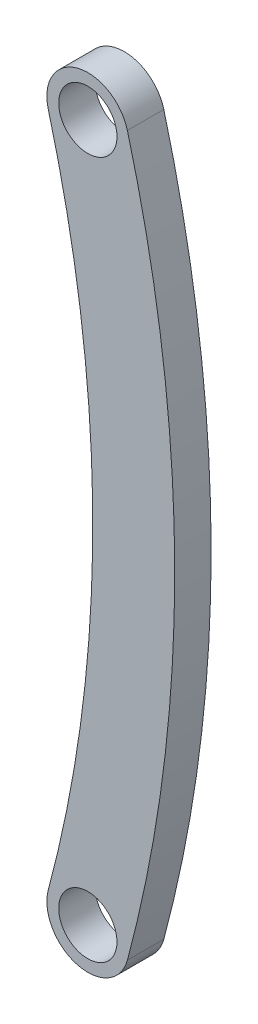
ISO-10303-21;
HEADER;
FILE_DESCRIPTION(('STEP AP214'),'2;1');
FILE_NAME('part.step','',(''),(''),'','','');
FILE_SCHEMA(('AUTOMOTIVE_DESIGN { 1 0 10303 214 1 1 1 1 }'));
ENDSEC;
DATA;
#1=APPLICATION_CONTEXT('core data for automotive mechanical design processes');
#2=APPLICATION_PROTOCOL_DEFINITION('international standard','automotive_design',2000,#1);
#3=PRODUCT_CONTEXT('',#1,'mechanical');
#4=PRODUCT('Part','Part','',(#3));
#5=PRODUCT_RELATED_PRODUCT_CATEGORY('part','',(#4));
#6=PRODUCT_DEFINITION_FORMATION('','',#4);
#7=PRODUCT_DEFINITION_CONTEXT('part definition',#1,'design');
#8=PRODUCT_DEFINITION('design','',#6,#7);
#9=PRODUCT_DEFINITION_SHAPE('','',#8);
#10=(LENGTH_UNIT() NAMED_UNIT(*) SI_UNIT(.MILLI.,.METRE.));
#11=(NAMED_UNIT(*) PLANE_ANGLE_UNIT() SI_UNIT($,.RADIAN.));
#12=(NAMED_UNIT(*) SI_UNIT($,.STERADIAN.) SOLID_ANGLE_UNIT());
#13=UNCERTAINTY_MEASURE_WITH_UNIT(LENGTH_MEASURE(1.E-05),#10,'distance_accuracy_value','');
#14=(GEOMETRIC_REPRESENTATION_CONTEXT(3) GLOBAL_UNCERTAINTY_ASSIGNED_CONTEXT((#13)) GLOBAL_UNIT_ASSIGNED_CONTEXT((#10,
#11,#12)) REPRESENTATION_CONTEXT('',''));
#15=CARTESIAN_POINT('',(0.,0.,0.));
#16=DIRECTION('',(0.,0.,1.));
#17=DIRECTION('',(1.,0.,0.));
#18=AXIS2_PLACEMENT_3D('',#15,#16,#17);
#19=CARTESIAN_POINT('',(71.478511145391,19.152609337587,45.75));
#20=DIRECTION('',(0.,0.,1.));
#21=DIRECTION('',(1.,0.,0.));
#22=AXIS2_PLACEMENT_3D('',#19,#20,#21);
#23=CYLINDRICAL_SURFACE('',#22,1.6);
#24=DIRECTION('',(0.,0.,1.));
#25=VECTOR('',#24,1.);
#26=CARTESIAN_POINT('',(73.078511145391,19.152609337587,45.75));
#27=LINE('',#26,#25);
#28=CARTESIAN_POINT('',(73.078511145391,19.152609337587,46.75));
#29=VERTEX_POINT('',#28);
#30=CARTESIAN_POINT('',(73.078511145391,19.152609337587,48.75));
#31=VERTEX_POINT('',#30);
#32=EDGE_CURVE('E9',#29,#31,#27,.T.);
#33=ORIENTED_EDGE('',*,*,#32,.F.);
#34=CARTESIAN_POINT('',(71.478511145391,19.152609337587,46.75));
#35=DIRECTION('',(0.,0.,1.));
#36=DIRECTION('',(1.,0.,0.));
#37=AXIS2_PLACEMENT_3D('',#34,#35,#36);
#38=CIRCLE('',#37,1.6);
#39=EDGE_CURVE('E93',#29,#29,#38,.T.);
#40=ORIENTED_EDGE('',*,*,#39,.F.);
#41=ORIENTED_EDGE('',*,*,#32,.T.);
#42=CARTESIAN_POINT('',(71.478511145391,19.152609337587,48.75));
#43=DIRECTION('',(0.,0.,1.));
#44=DIRECTION('',(1.,0.,0.));
#45=AXIS2_PLACEMENT_3D('',#42,#43,#44);
#46=CIRCLE('',#45,1.6);
#47=EDGE_CURVE('E120',#31,#31,#46,.T.);
#48=ORIENTED_EDGE('',*,*,#47,.T.);
#49=EDGE_LOOP('',(#33,#40,#41,#48));
#50=FACE_BOUND('',#49,.T.);
#51=ADVANCED_FACE('F15',(#50),#23,.F.);
#52=CARTESIAN_POINT('',(71.478511145391,-19.15260933758,45.75));
#53=DIRECTION('',(0.,0.,1.));
#54=DIRECTION('',(1.,0.,0.));
#55=AXIS2_PLACEMENT_3D('',#52,#53,#54);
#56=CYLINDRICAL_SURFACE('',#55,1.6);
#57=DIRECTION('',(0.,0.,1.));
#58=VECTOR('',#57,1.);
#59=CARTESIAN_POINT('',(73.078511145391,-19.15260933758,45.75));
#60=LINE('',#59,#58);
#61=CARTESIAN_POINT('',(73.078511145391,-19.15260933758,46.75));
#62=VERTEX_POINT('',#61);
#63=CARTESIAN_POINT('',(73.078511145391,-19.15260933758,48.75));
#64=VERTEX_POINT('',#63);
#65=EDGE_CURVE('E25',#62,#64,#60,.T.);
#66=ORIENTED_EDGE('',*,*,#65,.F.);
#67=CARTESIAN_POINT('',(71.478511145391,-19.15260933758,46.75));
#68=DIRECTION('',(0.,0.,1.));
#69=DIRECTION('',(1.,0.,0.));
#70=AXIS2_PLACEMENT_3D('',#67,#68,#69);
#71=CIRCLE('',#70,1.6);
#72=EDGE_CURVE('E99',#62,#62,#71,.T.);
#73=ORIENTED_EDGE('',*,*,#72,.F.);
#74=ORIENTED_EDGE('',*,*,#65,.T.);
#75=CARTESIAN_POINT('',(71.478511145391,-19.15260933758,48.75));
#76=DIRECTION('',(0.,0.,1.));
#77=DIRECTION('',(1.,0.,0.));
#78=AXIS2_PLACEMENT_3D('',#75,#76,#77);
#79=CIRCLE('',#78,1.6);
#80=EDGE_CURVE('E117',#64,#64,#79,.T.);
#81=ORIENTED_EDGE('',*,*,#80,.T.);
#82=EDGE_LOOP('',(#66,#73,#74,#81));
#83=FACE_BOUND('',#82,.T.);
#84=ADVANCED_FACE('F17',(#83),#56,.F.);
#85=CARTESIAN_POINT('',(0.,0.,46.75));
#86=DIRECTION('',(0.,0.,1.));
#87=DIRECTION('',(0.965925826288944,-0.258819045102985,0.));
#88=AXIS2_PLACEMENT_3D('',#85,#86,#87);
#89=CYLINDRICAL_SURFACE('',#88,71.75);
#90=DIRECTION('',(0.,0.,1.));
#91=VECTOR('',#90,1.);
#92=CARTESIAN_POINT('',(69.305178036241,18.570266486106,46.75));
#93=LINE('',#92,#91);
#94=CARTESIAN_POINT('',(69.305178036241,18.570266486106,46.75));
#95=VERTEX_POINT('',#94);
#96=CARTESIAN_POINT('',(69.305178036241,18.570266486106,48.75));
#97=VERTEX_POINT('',#96);
#98=EDGE_CURVE('E96',#95,#97,#93,.T.);
#99=ORIENTED_EDGE('',*,*,#98,.F.);
#100=CARTESIAN_POINT('',(0.,0.,46.75));
#101=DIRECTION('',(0.,0.,1.));
#102=DIRECTION('',(0.965925826288944,-0.258819045102985,0.));
#103=AXIS2_PLACEMENT_3D('',#100,#101,#102);
#104=CIRCLE('',#103,71.75);
#105=CARTESIAN_POINT('',(69.305178036241,-18.5702664861,46.75));
#106=VERTEX_POINT('',#105);
#107=EDGE_CURVE('E94',#106,#95,#104,.T.);
#108=ORIENTED_EDGE('',*,*,#107,.F.);
#109=DIRECTION('',(0.,0.,1.));
#110=VECTOR('',#109,1.);
#111=CARTESIAN_POINT('',(69.305178036241,-18.5702664861,46.75));
#112=LINE('',#111,#110);
#113=CARTESIAN_POINT('',(69.305178036241,-18.5702664861,48.75));
#114=VERTEX_POINT('',#113);
#115=EDGE_CURVE('E78',#106,#114,#112,.T.);
#116=ORIENTED_EDGE('',*,*,#115,.T.);
#117=CARTESIAN_POINT('',(0.,0.,48.75));
#118=DIRECTION('',(0.,0.,1.));
#119=DIRECTION('',(0.965925826288944,-0.258819045102985,0.));
#120=AXIS2_PLACEMENT_3D('',#117,#118,#119);
#121=CIRCLE('',#120,71.75);
#122=EDGE_CURVE('E128',#114,#97,#121,.T.);
#123=ORIENTED_EDGE('',*,*,#122,.T.);
#124=EDGE_LOOP('',(#99,#108,#116,#123));
#125=FACE_BOUND('',#124,.T.);
#126=ADVANCED_FACE('F92',(#125),#89,.F.);
#127=CARTESIAN_POINT('',(71.478511145391,-19.15260933758,46.75));
#128=DIRECTION('',(0.,0.,1.));
#129=DIRECTION('',(1.,0.,0.));
#130=AXIS2_PLACEMENT_3D('',#127,#128,#129);
#131=CYLINDRICAL_SURFACE('',#130,2.25);
#132=CARTESIAN_POINT('',(71.478511145391,-19.15260933758,48.75));
#133=DIRECTION('',(0.,0.,1.));
#134=DIRECTION('',(1.,0.,0.));
#135=AXIS2_PLACEMENT_3D('',#132,#133,#134);
#136=CIRCLE('',#135,2.25);
#137=CARTESIAN_POINT('',(73.651844254541,-19.73495218906,48.75));
#138=VERTEX_POINT('',#137);
#139=EDGE_CURVE('E88',#114,#138,#136,.T.);
#140=ORIENTED_EDGE('',*,*,#139,.F.);
#141=ORIENTED_EDGE('',*,*,#115,.F.);
#142=CARTESIAN_POINT('',(71.478511145391,-19.15260933758,46.75));
#143=DIRECTION('',(0.,0.,1.));
#144=DIRECTION('',(1.,0.,0.));
#145=AXIS2_PLACEMENT_3D('',#142,#143,#144);
#146=CIRCLE('',#145,2.25);
#147=CARTESIAN_POINT('',(73.651844254541,-19.73495218906,46.75));
#148=VERTEX_POINT('',#147);
#149=EDGE_CURVE('E82',#106,#148,#146,.T.);
#150=ORIENTED_EDGE('',*,*,#149,.T.);
#151=DIRECTION('',(0.,0.,1.));
#152=VECTOR('',#151,1.);
#153=CARTESIAN_POINT('',(73.651844254541,-19.73495218906,46.75));
#154=LINE('',#153,#152);
#155=EDGE_CURVE('E222',#148,#138,#154,.T.);
#156=ORIENTED_EDGE('',*,*,#155,.T.);
#157=EDGE_LOOP('',(#140,#141,#150,#156));
#158=FACE_BOUND('',#157,.T.);
#159=ADVANCED_FACE('F81',(#158),#131,.T.);
#160=CARTESIAN_POINT('',(0.,0.,46.75));
#161=DIRECTION('',(0.,0.,1.));
#162=DIRECTION('',(1.,0.,0.));
#163=AXIS2_PLACEMENT_3D('',#160,#161,#162);
#164=PLANE('',#163);
#165=ORIENTED_EDGE('',*,*,#39,.T.);
#166=EDGE_LOOP('',(#165));
#167=FACE_BOUND('',#166,.T.);
#168=ORIENTED_EDGE('',*,*,#72,.T.);
#169=EDGE_LOOP('',(#168));
#170=FACE_BOUND('',#169,.T.);
#171=ORIENTED_EDGE('',*,*,#149,.F.);
#172=ORIENTED_EDGE('',*,*,#107,.T.);
#173=CARTESIAN_POINT('',(71.478511145391,19.152609337587,46.75));
#174=DIRECTION('',(0.,0.,1.));
#175=DIRECTION('',(1.,0.,0.));
#176=AXIS2_PLACEMENT_3D('',#173,#174,#175);
#177=CIRCLE('',#176,2.25);
#178=CARTESIAN_POINT('',(73.651844254541,19.734952189067,46.75));
#179=VERTEX_POINT('',#178);
#180=EDGE_CURVE('E115',#179,#95,#177,.T.);
#181=ORIENTED_EDGE('',*,*,#180,.F.);
#182=CARTESIAN_POINT('',(0.,0.,46.75));
#183=DIRECTION('',(0.,0.,1.));
#184=DIRECTION('',(0.965925826288944,-0.258819045102985,0.));
#185=AXIS2_PLACEMENT_3D('',#182,#183,#184);
#186=CIRCLE('',#185,76.25);
#187=EDGE_CURVE('E102',#148,#179,#186,.T.);
#188=ORIENTED_EDGE('',*,*,#187,.F.);
#189=EDGE_LOOP('',(#171,#172,#181,#188));
#190=FACE_BOUND('',#189,.T.);
#191=ADVANCED_FACE('F105',(#167,#170,#190),#164,.F.);
#192=CARTESIAN_POINT('',(71.478511145391,19.152609337587,46.75));
#193=DIRECTION('',(0.,0.,1.));
#194=DIRECTION('',(1.,0.,0.));
#195=AXIS2_PLACEMENT_3D('',#192,#193,#194);
#196=CYLINDRICAL_SURFACE('',#195,2.25);
#197=CARTESIAN_POINT('',(71.478511145391,19.152609337587,48.75));
#198=DIRECTION('',(0.,0.,1.));
#199=DIRECTION('',(1.,0.,0.));
#200=AXIS2_PLACEMENT_3D('',#197,#198,#199);
#201=CIRCLE('',#200,2.25);
#202=CARTESIAN_POINT('',(73.651844254541,19.734952189067,48.75));
#203=VERTEX_POINT('',#202);
#204=EDGE_CURVE('E123',#203,#97,#201,.T.);
#205=ORIENTED_EDGE('',*,*,#204,.F.);
#206=DIRECTION('',(0.,0.,1.));
#207=VECTOR('',#206,1.);
#208=CARTESIAN_POINT('',(73.651844254541,19.734952189067,46.75));
#209=LINE('',#208,#207);
#210=EDGE_CURVE('E122',#179,#203,#209,.T.);
#211=ORIENTED_EDGE('',*,*,#210,.F.);
#212=ORIENTED_EDGE('',*,*,#180,.T.);
#213=ORIENTED_EDGE('',*,*,#98,.T.);
#214=EDGE_LOOP('',(#205,#211,#212,#213));
#215=FACE_BOUND('',#214,.T.);
#216=ADVANCED_FACE('F149',(#215),#196,.T.);
#217=CARTESIAN_POINT('',(0.,0.,48.75));
#218=DIRECTION('',(0.,0.,1.));
#219=DIRECTION('',(1.,0.,0.));
#220=AXIS2_PLACEMENT_3D('',#217,#218,#219);
#221=PLANE('',#220);
#222=ORIENTED_EDGE('',*,*,#47,.F.);
#223=EDGE_LOOP('',(#222));
#224=FACE_BOUND('',#223,.T.);
#225=ORIENTED_EDGE('',*,*,#80,.F.);
#226=EDGE_LOOP('',(#225));
#227=FACE_BOUND('',#226,.T.);
#228=CARTESIAN_POINT('',(0.,0.,48.75));
#229=DIRECTION('',(0.,0.,1.));
#230=DIRECTION('',(0.965925826288944,-0.258819045102985,0.));
#231=AXIS2_PLACEMENT_3D('',#228,#229,#230);
#232=CIRCLE('',#231,76.25);
#233=EDGE_CURVE('E219',#138,#203,#232,.T.);
#234=ORIENTED_EDGE('',*,*,#233,.T.);
#235=ORIENTED_EDGE('',*,*,#204,.T.);
#236=ORIENTED_EDGE('',*,*,#122,.F.);
#237=ORIENTED_EDGE('',*,*,#139,.T.);
#238=EDGE_LOOP('',(#234,#235,#236,#237));
#239=FACE_BOUND('',#238,.T.);
#240=ADVANCED_FACE('F160',(#224,#227,#239),#221,.T.);
#241=CARTESIAN_POINT('',(0.,0.,46.75));
#242=DIRECTION('',(0.,0.,1.));
#243=DIRECTION('',(0.965925826288944,-0.258819045102985,0.));
#244=AXIS2_PLACEMENT_3D('',#241,#242,#243);
#245=CYLINDRICAL_SURFACE('',#244,76.25);
#246=ORIENTED_EDGE('',*,*,#233,.F.);
#247=ORIENTED_EDGE('',*,*,#155,.F.);
#248=ORIENTED_EDGE('',*,*,#187,.T.);
#249=ORIENTED_EDGE('',*,*,#210,.T.);
#250=EDGE_LOOP('',(#246,#247,#248,#249));
#251=FACE_BOUND('',#250,.T.);
#252=ADVANCED_FACE('F205',(#251),#245,.T.);
#253=CLOSED_SHELL('',(#51,#84,#126,#159,#191,#216,#240,#252));
#254=MANIFOLD_SOLID_BREP('B1',#253);
#255=ADVANCED_BREP_SHAPE_REPRESENTATION('',(#18,#254),#14);
#256=SHAPE_DEFINITION_REPRESENTATION(#9,#255);
ENDSEC;
END-ISO-10303-21;
